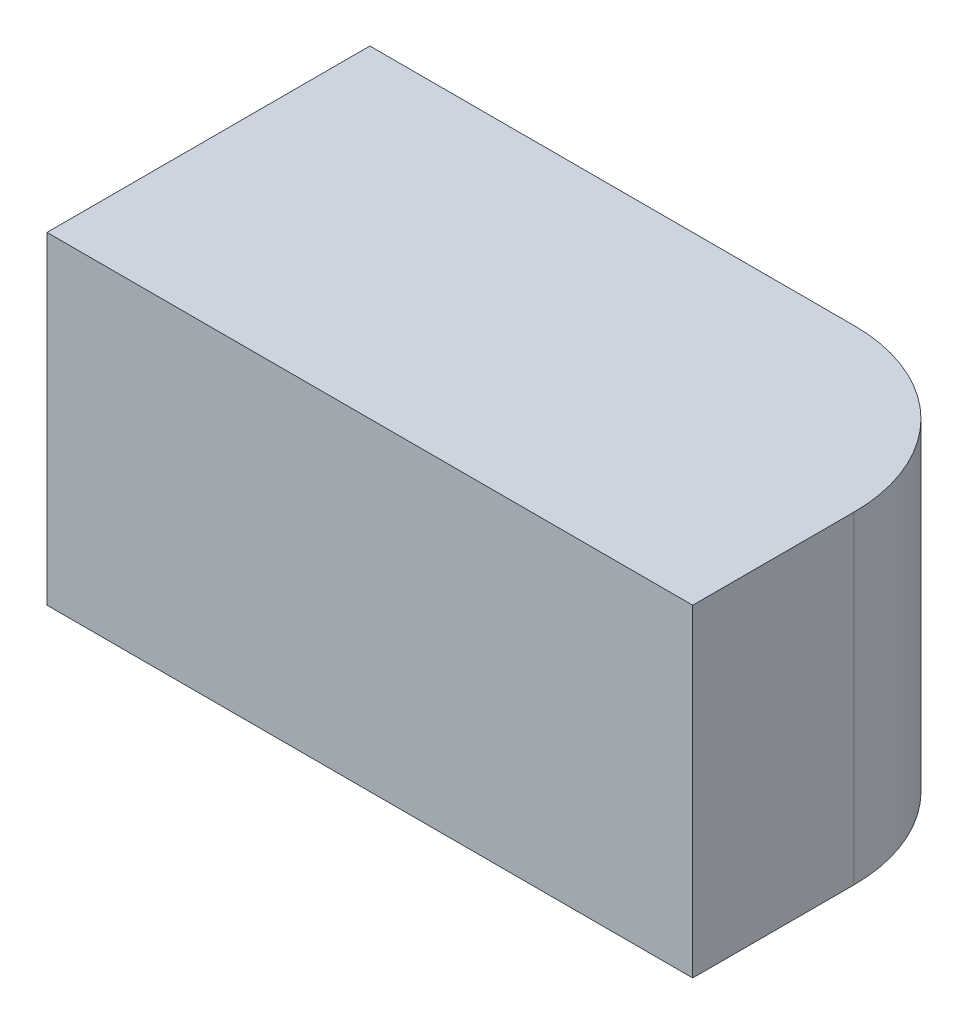
ISO-10303-21;
HEADER;
FILE_DESCRIPTION(('STEP AP214'),'2;1');
FILE_NAME('part.step','',(''),(''),'','','');
FILE_SCHEMA(('AUTOMOTIVE_DESIGN { 1 0 10303 214 1 1 1 1 }'));
ENDSEC;
DATA;
#1=APPLICATION_CONTEXT('core data for automotive mechanical design processes');
#2=APPLICATION_PROTOCOL_DEFINITION('international standard','automotive_design',2000,#1);
#3=PRODUCT_CONTEXT('',#1,'mechanical');
#4=PRODUCT('Part','Part','',(#3));
#5=PRODUCT_RELATED_PRODUCT_CATEGORY('part','',(#4));
#6=PRODUCT_DEFINITION_FORMATION('','',#4);
#7=PRODUCT_DEFINITION_CONTEXT('part definition',#1,'design');
#8=PRODUCT_DEFINITION('design','',#6,#7);
#9=PRODUCT_DEFINITION_SHAPE('','',#8);
#10=(LENGTH_UNIT() NAMED_UNIT(*) SI_UNIT(.MILLI.,.METRE.));
#11=(NAMED_UNIT(*) PLANE_ANGLE_UNIT() SI_UNIT($,.RADIAN.));
#12=(NAMED_UNIT(*) SI_UNIT($,.STERADIAN.) SOLID_ANGLE_UNIT());
#13=UNCERTAINTY_MEASURE_WITH_UNIT(LENGTH_MEASURE(1.E-05),#10,'distance_accuracy_value','');
#14=(GEOMETRIC_REPRESENTATION_CONTEXT(3) GLOBAL_UNCERTAINTY_ASSIGNED_CONTEXT((#13)) GLOBAL_UNIT_ASSIGNED_CONTEXT((#10,
#11,#12)) REPRESENTATION_CONTEXT('',''));
#15=CARTESIAN_POINT('',(0.,0.,0.));
#16=DIRECTION('',(0.,0.,1.));
#17=DIRECTION('',(1.,0.,0.));
#18=AXIS2_PLACEMENT_3D('',#15,#16,#17);
#19=CARTESIAN_POINT('',(-10.,20.,20.));
#20=DIRECTION('',(-1.,0.,0.));
#21=DIRECTION('',(0.,0.,-1.));
#22=AXIS2_PLACEMENT_3D('',#19,#20,#21);
#23=PLANE('',#22);
#24=DIRECTION('',(0.,0.,1.));
#25=VECTOR('',#24,1.);
#26=CARTESIAN_POINT('',(-10.,0.,20.));
#27=LINE('',#26,#25);
#28=CARTESIAN_POINT('',(-10.,0.,10.));
#29=VERTEX_POINT('',#28);
#30=CARTESIAN_POINT('',(-10.,0.,20.));
#31=VERTEX_POINT('',#30);
#32=EDGE_CURVE('E119',#29,#31,#27,.T.);
#33=ORIENTED_EDGE('',*,*,#32,.F.);
#34=DIRECTION('',(0.,-1.,0.));
#35=VECTOR('',#34,1.);
#36=CARTESIAN_POINT('',(-10.,20.,10.));
#37=LINE('',#36,#35);
#38=CARTESIAN_POINT('',(-10.,20.,10.));
#39=VERTEX_POINT('',#38);
#40=EDGE_CURVE('E118',#39,#29,#37,.T.);
#41=ORIENTED_EDGE('',*,*,#40,.F.);
#42=DIRECTION('',(0.,0.,1.));
#43=VECTOR('',#42,1.);
#44=CARTESIAN_POINT('',(-10.,20.,20.));
#45=LINE('',#44,#43);
#46=CARTESIAN_POINT('',(-10.,20.,20.));
#47=VERTEX_POINT('',#46);
#48=EDGE_CURVE('E112',#39,#47,#45,.T.);
#49=ORIENTED_EDGE('',*,*,#48,.T.);
#50=DIRECTION('',(0.,-1.,0.));
#51=VECTOR('',#50,1.);
#52=CARTESIAN_POINT('',(-10.,20.,20.));
#53=LINE('',#52,#51);
#54=EDGE_CURVE('E11',#47,#31,#53,.T.);
#55=ORIENTED_EDGE('',*,*,#54,.T.);
#56=EDGE_LOOP('',(#33,#41,#49,#55));
#57=FACE_BOUND('',#56,.T.);
#58=ADVANCED_FACE('F38',(#57),#23,.F.);
#59=CARTESIAN_POINT('',(-10.,20.,20.));
#60=DIRECTION('',(0.,0.,-1.));
#61=DIRECTION('',(1.,0.,0.));
#62=AXIS2_PLACEMENT_3D('',#59,#60,#61);
#63=PLANE('',#62);
#64=DIRECTION('',(-1.,0.,0.));
#65=VECTOR('',#64,1.);
#66=CARTESIAN_POINT('',(-10.,0.,20.));
#67=LINE('',#66,#65);
#68=CARTESIAN_POINT('',(-50.,0.,20.));
#69=VERTEX_POINT('',#68);
#70=EDGE_CURVE('E122',#31,#69,#67,.T.);
#71=ORIENTED_EDGE('',*,*,#70,.F.);
#72=ORIENTED_EDGE('',*,*,#54,.F.);
#73=DIRECTION('',(-1.,0.,0.));
#74=VECTOR('',#73,1.);
#75=CARTESIAN_POINT('',(-10.,20.,20.));
#76=LINE('',#75,#74);
#77=CARTESIAN_POINT('',(-50.,20.,20.));
#78=VERTEX_POINT('',#77);
#79=EDGE_CURVE('E84',#47,#78,#76,.T.);
#80=ORIENTED_EDGE('',*,*,#79,.T.);
#81=DIRECTION('',(0.,-1.,0.));
#82=VECTOR('',#81,1.);
#83=CARTESIAN_POINT('',(-50.,20.,20.));
#84=LINE('',#83,#82);
#85=EDGE_CURVE('E47',#78,#69,#84,.T.);
#86=ORIENTED_EDGE('',*,*,#85,.T.);
#87=EDGE_LOOP('',(#71,#72,#80,#86));
#88=FACE_BOUND('',#87,.T.);
#89=ADVANCED_FACE('F138',(#88),#63,.F.);
#90=CARTESIAN_POINT('',(-50.,20.,20.));
#91=DIRECTION('',(1.,0.,0.));
#92=DIRECTION('',(0.,0.,1.));
#93=AXIS2_PLACEMENT_3D('',#90,#91,#92);
#94=PLANE('',#93);
#95=DIRECTION('',(0.,0.,-1.));
#96=VECTOR('',#95,1.);
#97=CARTESIAN_POINT('',(-50.,0.,20.));
#98=LINE('',#97,#96);
#99=CARTESIAN_POINT('',(-50.,0.,0.));
#100=VERTEX_POINT('',#99);
#101=EDGE_CURVE('E126',#69,#100,#98,.T.);
#102=ORIENTED_EDGE('',*,*,#101,.F.);
#103=ORIENTED_EDGE('',*,*,#85,.F.);
#104=DIRECTION('',(0.,0.,-1.));
#105=VECTOR('',#104,1.);
#106=CARTESIAN_POINT('',(-50.,20.,20.));
#107=LINE('',#106,#105);
#108=CARTESIAN_POINT('',(-50.,20.,0.));
#109=VERTEX_POINT('',#108);
#110=EDGE_CURVE('E93',#78,#109,#107,.T.);
#111=ORIENTED_EDGE('',*,*,#110,.T.);
#112=DIRECTION('',(0.,-1.,0.));
#113=VECTOR('',#112,1.);
#114=CARTESIAN_POINT('',(-50.,20.,0.));
#115=LINE('',#114,#113);
#116=EDGE_CURVE('E99',#109,#100,#115,.T.);
#117=ORIENTED_EDGE('',*,*,#116,.T.);
#118=EDGE_LOOP('',(#102,#103,#111,#117));
#119=FACE_BOUND('',#118,.T.);
#120=ADVANCED_FACE('F107',(#119),#94,.F.);
#121=CARTESIAN_POINT('',(-20.,20.,0.));
#122=DIRECTION('',(0.,0.,1.));
#123=DIRECTION('',(-1.,0.,0.));
#124=AXIS2_PLACEMENT_3D('',#121,#122,#123);
#125=PLANE('',#124);
#126=DIRECTION('',(1.,0.,0.));
#127=VECTOR('',#126,1.);
#128=CARTESIAN_POINT('',(-20.,0.,0.));
#129=LINE('',#128,#127);
#130=CARTESIAN_POINT('',(-20.,0.,0.));
#131=VERTEX_POINT('',#130);
#132=EDGE_CURVE('E101',#100,#131,#129,.T.);
#133=ORIENTED_EDGE('',*,*,#132,.F.);
#134=ORIENTED_EDGE('',*,*,#116,.F.);
#135=DIRECTION('',(1.,0.,0.));
#136=VECTOR('',#135,1.);
#137=CARTESIAN_POINT('',(-20.,20.,0.));
#138=LINE('',#137,#136);
#139=CARTESIAN_POINT('',(-20.,20.,0.));
#140=VERTEX_POINT('',#139);
#141=EDGE_CURVE('E89',#109,#140,#138,.T.);
#142=ORIENTED_EDGE('',*,*,#141,.T.);
#143=DIRECTION('',(0.,-1.,0.));
#144=VECTOR('',#143,1.);
#145=CARTESIAN_POINT('',(-20.,20.,0.));
#146=LINE('',#145,#144);
#147=EDGE_CURVE('E105',#140,#131,#146,.T.);
#148=ORIENTED_EDGE('',*,*,#147,.T.);
#149=EDGE_LOOP('',(#133,#134,#142,#148));
#150=FACE_BOUND('',#149,.T.);
#151=ADVANCED_FACE('F100',(#150),#125,.F.);
#152=CARTESIAN_POINT('',(-20.,20.,10.));
#153=DIRECTION('',(0.,-1.,0.));
#154=DIRECTION('',(0.,0.,-1.));
#155=AXIS2_PLACEMENT_3D('',#152,#153,#154);
#156=CYLINDRICAL_SURFACE('',#155,10.);
#157=CARTESIAN_POINT('',(-20.,0.,10.));
#158=DIRECTION('',(0.,-1.,0.));
#159=DIRECTION('',(0.,0.,-1.));
#160=AXIS2_PLACEMENT_3D('',#157,#158,#159);
#161=CIRCLE('',#160,10.);
#162=EDGE_CURVE('E72',#131,#29,#161,.T.);
#163=ORIENTED_EDGE('',*,*,#162,.F.);
#164=ORIENTED_EDGE('',*,*,#147,.F.);
#165=CARTESIAN_POINT('',(-20.,20.,10.));
#166=DIRECTION('',(0.,-1.,0.));
#167=DIRECTION('',(0.,0.,-1.));
#168=AXIS2_PLACEMENT_3D('',#165,#166,#167);
#169=CIRCLE('',#168,10.);
#170=EDGE_CURVE('E55',#140,#39,#169,.T.);
#171=ORIENTED_EDGE('',*,*,#170,.T.);
#172=ORIENTED_EDGE('',*,*,#40,.T.);
#173=EDGE_LOOP('',(#163,#164,#171,#172));
#174=FACE_BOUND('',#173,.T.);
#175=ADVANCED_FACE('F145',(#174),#156,.T.);
#176=CARTESIAN_POINT('',(-20.,20.,10.));
#177=DIRECTION('',(0.,-1.,0.));
#178=DIRECTION('',(0.,0.,-1.));
#179=AXIS2_PLACEMENT_3D('',#176,#177,#178);
#180=PLANE('',#179);
#181=ORIENTED_EDGE('',*,*,#48,.F.);
#182=ORIENTED_EDGE('',*,*,#170,.F.);
#183=ORIENTED_EDGE('',*,*,#141,.F.);
#184=ORIENTED_EDGE('',*,*,#110,.F.);
#185=ORIENTED_EDGE('',*,*,#79,.F.);
#186=EDGE_LOOP('',(#181,#182,#183,#184,#185));
#187=FACE_BOUND('',#186,.T.);
#188=ADVANCED_FACE('F91',(#187),#180,.F.);
#189=CARTESIAN_POINT('',(-20.,0.,10.));
#190=DIRECTION('',(0.,-1.,0.));
#191=DIRECTION('',(0.,0.,-1.));
#192=AXIS2_PLACEMENT_3D('',#189,#190,#191);
#193=PLANE('',#192);
#194=ORIENTED_EDGE('',*,*,#32,.T.);
#195=ORIENTED_EDGE('',*,*,#70,.T.);
#196=ORIENTED_EDGE('',*,*,#101,.T.);
#197=ORIENTED_EDGE('',*,*,#132,.T.);
#198=ORIENTED_EDGE('',*,*,#162,.T.);
#199=EDGE_LOOP('',(#194,#195,#196,#197,#198));
#200=FACE_BOUND('',#199,.T.);
#201=ADVANCED_FACE('F139',(#200),#193,.T.);
#202=CLOSED_SHELL('',(#58,#89,#120,#151,#175,#188,#201));
#203=MANIFOLD_SOLID_BREP('B2',#202);
#204=ADVANCED_BREP_SHAPE_REPRESENTATION('',(#18,#203),#14);
#205=SHAPE_DEFINITION_REPRESENTATION(#9,#204);
ENDSEC;
END-ISO-10303-21;
